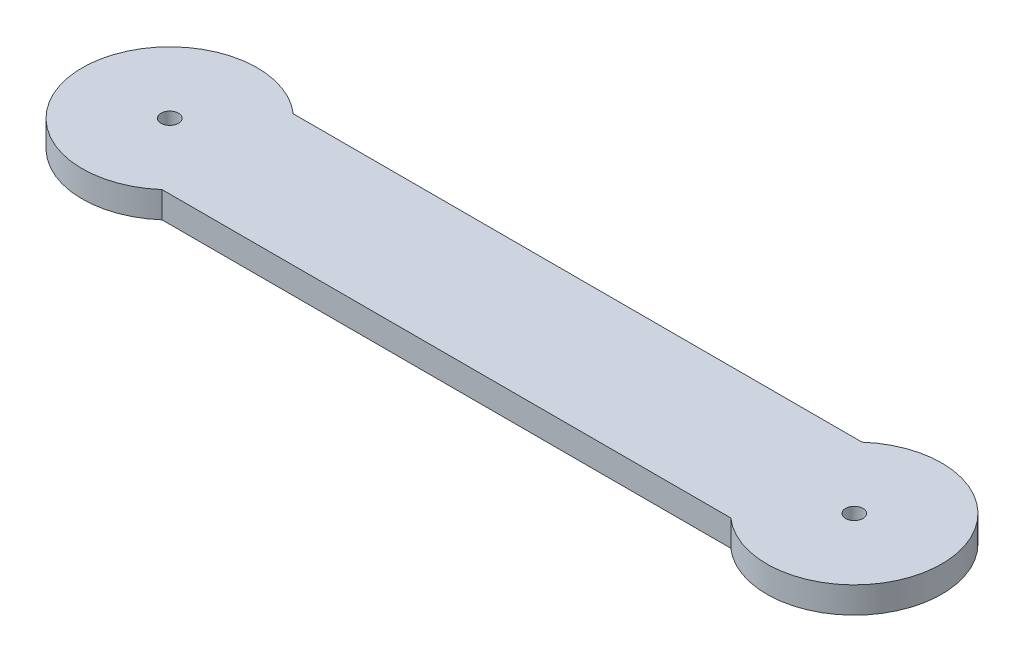
ISO-10303-21;
HEADER;
FILE_DESCRIPTION(('STEP AP214'),'2;1');
FILE_NAME('part.step','',(''),(''),'','','');
FILE_SCHEMA(('AUTOMOTIVE_DESIGN { 1 0 10303 214 1 1 1 1 }'));
ENDSEC;
DATA;
#1=APPLICATION_CONTEXT('core data for automotive mechanical design processes');
#2=APPLICATION_PROTOCOL_DEFINITION('international standard','automotive_design',2000,#1);
#3=PRODUCT_CONTEXT('',#1,'mechanical');
#4=PRODUCT('Part','Part','',(#3));
#5=PRODUCT_RELATED_PRODUCT_CATEGORY('part','',(#4));
#6=PRODUCT_DEFINITION_FORMATION('','',#4);
#7=PRODUCT_DEFINITION_CONTEXT('part definition',#1,'design');
#8=PRODUCT_DEFINITION('design','',#6,#7);
#9=PRODUCT_DEFINITION_SHAPE('','',#8);
#10=(LENGTH_UNIT() NAMED_UNIT(*) SI_UNIT(.MILLI.,.METRE.));
#11=(NAMED_UNIT(*) PLANE_ANGLE_UNIT() SI_UNIT($,.RADIAN.));
#12=(NAMED_UNIT(*) SI_UNIT($,.STERADIAN.) SOLID_ANGLE_UNIT());
#13=UNCERTAINTY_MEASURE_WITH_UNIT(LENGTH_MEASURE(1.E-05),#10,'distance_accuracy_value','');
#14=(GEOMETRIC_REPRESENTATION_CONTEXT(3) GLOBAL_UNCERTAINTY_ASSIGNED_CONTEXT((#13)) GLOBAL_UNIT_ASSIGNED_CONTEXT((#10,
#11,#12)) REPRESENTATION_CONTEXT('',''));
#15=CARTESIAN_POINT('',(0.,0.,0.));
#16=DIRECTION('',(0.,0.,1.));
#17=DIRECTION('',(1.,0.,0.));
#18=AXIS2_PLACEMENT_3D('',#15,#16,#17);
#19=CARTESIAN_POINT('',(6.61437827766148,3.,-7.5));
#20=DIRECTION('',(0.,-1.,0.));
#21=DIRECTION('',(0.,0.,-1.));
#22=AXIS2_PLACEMENT_3D('',#19,#20,#21);
#23=CYLINDRICAL_SURFACE('',#22,10.);
#24=CARTESIAN_POINT('',(6.61437827766148,0.,-7.5));
#25=DIRECTION('',(0.,1.,0.));
#26=DIRECTION('',(0.,0.,-1.));
#27=AXIS2_PLACEMENT_3D('',#24,#25,#26);
#28=CIRCLE('',#27,10.);
#29=CARTESIAN_POINT('',(0.,0.,0.));
#30=VERTEX_POINT('',#29);
#31=CARTESIAN_POINT('',(0.,0.,-15.));
#32=VERTEX_POINT('',#31);
#33=EDGE_CURVE('E105',#30,#32,#28,.T.);
#34=ORIENTED_EDGE('',*,*,#33,.T.);
#35=DIRECTION('',(0.,-1.,0.));
#36=VECTOR('',#35,1.);
#37=CARTESIAN_POINT('',(0.,3.,-15.));
#38=LINE('',#37,#36);
#39=CARTESIAN_POINT('',(0.,3.,-15.));
#40=VERTEX_POINT('',#39);
#41=EDGE_CURVE('E11',#40,#32,#38,.T.);
#42=ORIENTED_EDGE('',*,*,#41,.F.);
#43=CARTESIAN_POINT('',(6.61437827766148,3.,-7.5));
#44=DIRECTION('',(0.,1.,0.));
#45=DIRECTION('',(0.,0.,-1.));
#46=AXIS2_PLACEMENT_3D('',#43,#44,#45);
#47=CIRCLE('',#46,10.);
#48=CARTESIAN_POINT('',(0.,3.,0.));
#49=VERTEX_POINT('',#48);
#50=EDGE_CURVE('E92',#49,#40,#47,.T.);
#51=ORIENTED_EDGE('',*,*,#50,.F.);
#52=DIRECTION('',(0.,-1.,0.));
#53=VECTOR('',#52,1.);
#54=CARTESIAN_POINT('',(0.,3.,0.));
#55=LINE('',#54,#53);
#56=EDGE_CURVE('E101',#49,#30,#55,.T.);
#57=ORIENTED_EDGE('',*,*,#56,.T.);
#58=EDGE_LOOP('',(#34,#42,#51,#57));
#59=FACE_BOUND('',#58,.T.);
#60=ADVANCED_FACE('F39',(#59),#23,.T.);
#61=CARTESIAN_POINT('',(0.,3.,-15.));
#62=DIRECTION('',(0.,0.,1.));
#63=DIRECTION('',(1.,0.,0.));
#64=AXIS2_PLACEMENT_3D('',#61,#62,#63);
#65=PLANE('',#64);
#66=DIRECTION('',(-1.,0.,0.));
#67=VECTOR('',#66,1.);
#68=CARTESIAN_POINT('',(0.,0.,-15.));
#69=LINE('',#68,#67);
#70=CARTESIAN_POINT('',(-65.,0.,-15.));
#71=VERTEX_POINT('',#70);
#72=EDGE_CURVE('E96',#32,#71,#69,.T.);
#73=ORIENTED_EDGE('',*,*,#72,.T.);
#74=DIRECTION('',(0.,-1.,0.));
#75=VECTOR('',#74,1.);
#76=CARTESIAN_POINT('',(-65.,3.,-15.));
#77=LINE('',#76,#75);
#78=CARTESIAN_POINT('',(-65.,3.,-15.));
#79=VERTEX_POINT('',#78);
#80=EDGE_CURVE('E48',#79,#71,#77,.T.);
#81=ORIENTED_EDGE('',*,*,#80,.F.);
#82=DIRECTION('',(-1.,0.,0.));
#83=VECTOR('',#82,1.);
#84=CARTESIAN_POINT('',(0.,3.,-15.));
#85=LINE('',#84,#83);
#86=EDGE_CURVE('E87',#40,#79,#85,.T.);
#87=ORIENTED_EDGE('',*,*,#86,.F.);
#88=ORIENTED_EDGE('',*,*,#41,.T.);
#89=EDGE_LOOP('',(#73,#81,#87,#88));
#90=FACE_BOUND('',#89,.T.);
#91=ADVANCED_FACE('F95',(#90),#65,.F.);
#92=CARTESIAN_POINT('',(-71.6143782776615,3.,-7.49999999999999));
#93=DIRECTION('',(0.,-1.,0.));
#94=DIRECTION('',(0.,0.,-1.));
#95=AXIS2_PLACEMENT_3D('',#92,#93,#94);
#96=CYLINDRICAL_SURFACE('',#95,10.);
#97=CARTESIAN_POINT('',(-71.6143782776615,0.,-7.49999999999999));
#98=DIRECTION('',(0.,1.,0.));
#99=DIRECTION('',(0.,0.,1.));
#100=AXIS2_PLACEMENT_3D('',#97,#98,#99);
#101=CIRCLE('',#100,10.);
#102=CARTESIAN_POINT('',(-65.,0.,0.));
#103=VERTEX_POINT('',#102);
#104=EDGE_CURVE('E74',#71,#103,#101,.T.);
#105=ORIENTED_EDGE('',*,*,#104,.T.);
#106=DIRECTION('',(0.,-1.,0.));
#107=VECTOR('',#106,1.);
#108=CARTESIAN_POINT('',(-65.,3.,0.));
#109=LINE('',#108,#107);
#110=CARTESIAN_POINT('',(-65.,3.,0.));
#111=VERTEX_POINT('',#110);
#112=EDGE_CURVE('E97',#111,#103,#109,.T.);
#113=ORIENTED_EDGE('',*,*,#112,.F.);
#114=CARTESIAN_POINT('',(-71.6143782776615,3.,-7.49999999999999));
#115=DIRECTION('',(0.,1.,0.));
#116=DIRECTION('',(0.,0.,1.));
#117=AXIS2_PLACEMENT_3D('',#114,#115,#116);
#118=CIRCLE('',#117,10.);
#119=EDGE_CURVE('E90',#79,#111,#118,.T.);
#120=ORIENTED_EDGE('',*,*,#119,.F.);
#121=ORIENTED_EDGE('',*,*,#80,.T.);
#122=EDGE_LOOP('',(#105,#113,#120,#121));
#123=FACE_BOUND('',#122,.T.);
#124=ADVANCED_FACE('F99',(#123),#96,.T.);
#125=CARTESIAN_POINT('',(0.,3.,0.));
#126=DIRECTION('',(0.,0.,-1.));
#127=DIRECTION('',(-1.,0.,0.));
#128=AXIS2_PLACEMENT_3D('',#125,#126,#127);
#129=PLANE('',#128);
#130=DIRECTION('',(1.,0.,0.));
#131=VECTOR('',#130,1.);
#132=CARTESIAN_POINT('',(0.,0.,0.));
#133=LINE('',#132,#131);
#134=EDGE_CURVE('E80',#103,#30,#133,.T.);
#135=ORIENTED_EDGE('',*,*,#134,.T.);
#136=ORIENTED_EDGE('',*,*,#56,.F.);
#137=DIRECTION('',(1.,0.,0.));
#138=VECTOR('',#137,1.);
#139=CARTESIAN_POINT('',(0.,3.,0.));
#140=LINE('',#139,#138);
#141=EDGE_CURVE('E57',#111,#49,#140,.T.);
#142=ORIENTED_EDGE('',*,*,#141,.F.);
#143=ORIENTED_EDGE('',*,*,#112,.T.);
#144=EDGE_LOOP('',(#135,#136,#142,#143));
#145=FACE_BOUND('',#144,.T.);
#146=ADVANCED_FACE('F131',(#145),#129,.F.);
#147=CARTESIAN_POINT('',(6.61437827766148,3.,-7.5));
#148=DIRECTION('',(0.,-1.,0.));
#149=DIRECTION('',(0.,0.,-1.));
#150=AXIS2_PLACEMENT_3D('',#147,#148,#149);
#151=PLANE('',#150);
#152=CARTESIAN_POINT('',(-71.6143782776615,3.,-7.49999999999999));
#153=DIRECTION('',(0.,1.,0.));
#154=DIRECTION('',(0.,0.,1.));
#155=AXIS2_PLACEMENT_3D('',#152,#153,#154);
#156=CIRCLE('',#155,0.999999999999998);
#157=CARTESIAN_POINT('',(-71.6143782776615,3.,-6.49999999999999));
#158=VERTEX_POINT('',#157);
#159=EDGE_CURVE('E114',#158,#158,#156,.T.);
#160=ORIENTED_EDGE('',*,*,#159,.F.);
#161=EDGE_LOOP('',(#160));
#162=FACE_BOUND('',#161,.T.);
#163=CARTESIAN_POINT('',(6.61437827766148,3.,-7.5));
#164=DIRECTION('',(0.,1.,0.));
#165=DIRECTION('',(0.,0.,1.));
#166=AXIS2_PLACEMENT_3D('',#163,#164,#165);
#167=CIRCLE('',#166,1.);
#168=CARTESIAN_POINT('',(6.61437827766148,3.,-6.5));
#169=VERTEX_POINT('',#168);
#170=EDGE_CURVE('E119',#169,#169,#167,.T.);
#171=ORIENTED_EDGE('',*,*,#170,.F.);
#172=EDGE_LOOP('',(#171));
#173=FACE_BOUND('',#172,.T.);
#174=ORIENTED_EDGE('',*,*,#50,.T.);
#175=ORIENTED_EDGE('',*,*,#86,.T.);
#176=ORIENTED_EDGE('',*,*,#119,.T.);
#177=ORIENTED_EDGE('',*,*,#141,.T.);
#178=EDGE_LOOP('',(#174,#175,#176,#177));
#179=FACE_BOUND('',#178,.T.);
#180=ADVANCED_FACE('F88',(#162,#173,#179),#151,.F.);
#181=CARTESIAN_POINT('',(6.61437827766148,0.,-7.5));
#182=DIRECTION('',(0.,-1.,0.));
#183=DIRECTION('',(0.,0.,-1.));
#184=AXIS2_PLACEMENT_3D('',#181,#182,#183);
#185=PLANE('',#184);
#186=CARTESIAN_POINT('',(-71.6143782776615,0.,-7.49999999999999));
#187=DIRECTION('',(0.,-1.,0.));
#188=DIRECTION('',(0.,0.,-1.));
#189=AXIS2_PLACEMENT_3D('',#186,#187,#188);
#190=CIRCLE('',#189,0.999999999999998);
#191=CARTESIAN_POINT('',(-71.6143782776615,0.,-8.49999999999999));
#192=VERTEX_POINT('',#191);
#193=EDGE_CURVE('E42',#192,#192,#190,.T.);
#194=ORIENTED_EDGE('',*,*,#193,.F.);
#195=EDGE_LOOP('',(#194));
#196=FACE_BOUND('',#195,.T.);
#197=CARTESIAN_POINT('',(6.61437827766148,0.,-7.5));
#198=DIRECTION('',(0.,-1.,0.));
#199=DIRECTION('',(0.,0.,-1.));
#200=AXIS2_PLACEMENT_3D('',#197,#198,#199);
#201=CIRCLE('',#200,1.);
#202=CARTESIAN_POINT('',(6.61437827766148,0.,-8.5));
#203=VERTEX_POINT('',#202);
#204=EDGE_CURVE('E112',#203,#203,#201,.T.);
#205=ORIENTED_EDGE('',*,*,#204,.F.);
#206=EDGE_LOOP('',(#205));
#207=FACE_BOUND('',#206,.T.);
#208=ORIENTED_EDGE('',*,*,#33,.F.);
#209=ORIENTED_EDGE('',*,*,#134,.F.);
#210=ORIENTED_EDGE('',*,*,#104,.F.);
#211=ORIENTED_EDGE('',*,*,#72,.F.);
#212=EDGE_LOOP('',(#208,#209,#210,#211));
#213=FACE_BOUND('',#212,.T.);
#214=ADVANCED_FACE('F130',(#196,#207,#213),#185,.T.);
#215=CARTESIAN_POINT('',(6.61437827766148,-10.,-7.5));
#216=DIRECTION('',(0.,1.,0.));
#217=DIRECTION('',(0.,0.,1.));
#218=AXIS2_PLACEMENT_3D('',#215,#216,#217);
#219=CYLINDRICAL_SURFACE('',#218,1.);
#220=ORIENTED_EDGE('',*,*,#204,.T.);
#221=EDGE_LOOP('',(#220));
#222=FACE_BOUND('',#221,.T.);
#223=ORIENTED_EDGE('',*,*,#170,.T.);
#224=EDGE_LOOP('',(#223));
#225=FACE_BOUND('',#224,.T.);
#226=ADVANCED_FACE('F127',(#222,#225),#219,.F.);
#227=CARTESIAN_POINT('',(-71.6143782776615,-10.,-7.49999999999999));
#228=DIRECTION('',(0.,1.,0.));
#229=DIRECTION('',(0.,0.,1.));
#230=AXIS2_PLACEMENT_3D('',#227,#228,#229);
#231=CYLINDRICAL_SURFACE('',#230,0.999999999999998);
#232=ORIENTED_EDGE('',*,*,#193,.T.);
#233=EDGE_LOOP('',(#232));
#234=FACE_BOUND('',#233,.T.);
#235=ORIENTED_EDGE('',*,*,#159,.T.);
#236=EDGE_LOOP('',(#235));
#237=FACE_BOUND('',#236,.T.);
#238=ADVANCED_FACE('F178',(#234,#237),#231,.F.);
#239=CLOSED_SHELL('',(#60,#91,#124,#146,#180,#214,#226,#238));
#240=MANIFOLD_SOLID_BREP('B2',#239);
#241=ADVANCED_BREP_SHAPE_REPRESENTATION('',(#18,#240),#14);
#242=SHAPE_DEFINITION_REPRESENTATION(#9,#241);
ENDSEC;
END-ISO-10303-21;
